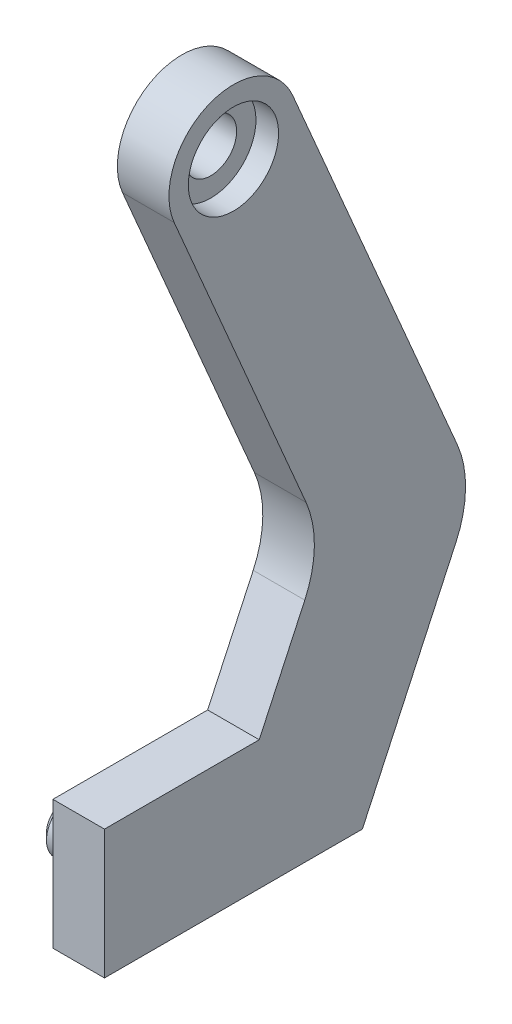
ISO-10303-21;
HEADER;
FILE_DESCRIPTION(('STEP AP214'),'2;1');
FILE_NAME('part.step','',(''),(''),'','','');
FILE_SCHEMA(('AUTOMOTIVE_DESIGN { 1 0 10303 214 1 1 1 1 }'));
ENDSEC;
DATA;
#1=APPLICATION_CONTEXT('core data for automotive mechanical design processes');
#2=APPLICATION_PROTOCOL_DEFINITION('international standard','automotive_design',2000,#1);
#3=PRODUCT_CONTEXT('',#1,'mechanical');
#4=PRODUCT('Part','Part','',(#3));
#5=PRODUCT_RELATED_PRODUCT_CATEGORY('part','',(#4));
#6=PRODUCT_DEFINITION_FORMATION('','',#4);
#7=PRODUCT_DEFINITION_CONTEXT('part definition',#1,'design');
#8=PRODUCT_DEFINITION('design','',#6,#7);
#9=PRODUCT_DEFINITION_SHAPE('','',#8);
#10=(LENGTH_UNIT() NAMED_UNIT(*) SI_UNIT(.MILLI.,.METRE.));
#11=(NAMED_UNIT(*) PLANE_ANGLE_UNIT() SI_UNIT($,.RADIAN.));
#12=(NAMED_UNIT(*) SI_UNIT($,.STERADIAN.) SOLID_ANGLE_UNIT());
#13=UNCERTAINTY_MEASURE_WITH_UNIT(LENGTH_MEASURE(1.E-05),#10,'distance_accuracy_value','');
#14=(GEOMETRIC_REPRESENTATION_CONTEXT(3) GLOBAL_UNCERTAINTY_ASSIGNED_CONTEXT((#13)) GLOBAL_UNIT_ASSIGNED_CONTEXT((#10,
#11,#12)) REPRESENTATION_CONTEXT('',''));
#15=CARTESIAN_POINT('',(0.,0.,0.));
#16=DIRECTION('',(0.,0.,1.));
#17=DIRECTION('',(1.,0.,0.));
#18=AXIS2_PLACEMENT_3D('',#15,#16,#17);
#19=CARTESIAN_POINT('',(140.789487757862,-15.875,57.15));
#20=DIRECTION('',(1.,0.,0.));
#21=DIRECTION('',(0.,1.,0.));
#22=AXIS2_PLACEMENT_3D('',#19,#20,#21);
#23=CYLINDRICAL_SURFACE('',#22,6.35);
#24=CARTESIAN_POINT('',(158.75,-15.875,57.15));
#25=DIRECTION('',(1.,0.,0.));
#26=DIRECTION('',(0.,1.,0.));
#27=AXIS2_PLACEMENT_3D('',#24,#25,#26);
#28=CIRCLE('',#27,6.35);
#29=CARTESIAN_POINT('',(158.75,-9.525,57.15));
#30=VERTEX_POINT('',#29);
#31=EDGE_CURVE('E333',#30,#30,#28,.F.);
#32=ORIENTED_EDGE('',*,*,#31,.T.);
#33=EDGE_LOOP('',(#32));
#34=FACE_BOUND('',#33,.T.);
#35=CARTESIAN_POINT('',(165.8874,-15.875,57.15));
#36=DIRECTION('',(1.,0.,0.));
#37=DIRECTION('',(0.,1.,0.));
#38=AXIS2_PLACEMENT_3D('',#35,#36,#37);
#39=CIRCLE('',#38,6.35);
#40=CARTESIAN_POINT('',(165.8874,-9.525,57.15));
#41=VERTEX_POINT('',#40);
#42=EDGE_CURVE('E314',#41,#41,#39,.F.);
#43=ORIENTED_EDGE('',*,*,#42,.F.);
#44=EDGE_LOOP('',(#43));
#45=FACE_BOUND('',#44,.T.);
#46=ADVANCED_FACE('F171',(#34,#45),#23,.F.);
#47=CARTESIAN_POINT('',(171.45,-174.625,88.9));
#48=DIRECTION('',(-1.,0.,0.));
#49=DIRECTION('',(0.,-1.,0.));
#50=AXIS2_PLACEMENT_3D('',#47,#48,#49);
#51=PLANE('',#50);
#52=CARTESIAN_POINT('',(171.45,-15.875,57.15));
#53=DIRECTION('',(-1.,0.,0.));
#54=DIRECTION('',(0.,-1.,0.));
#55=AXIS2_PLACEMENT_3D('',#52,#53,#54);
#56=CIRCLE('',#55,11.1125);
#57=CARTESIAN_POINT('',(171.45,-26.9875,57.15));
#58=VERTEX_POINT('',#57);
#59=EDGE_CURVE('E176',#58,#58,#56,.F.);
#60=ORIENTED_EDGE('',*,*,#59,.F.);
#61=EDGE_LOOP('',(#60));
#62=FACE_BOUND('',#61,.T.);
#63=CARTESIAN_POINT('',(171.45,-114.3,25.4));
#64=DIRECTION('',(1.,0.,0.));
#65=DIRECTION('',(0.,1.,0.));
#66=AXIS2_PLACEMENT_3D('',#63,#64,#65);
#67=CIRCLE('',#66,25.4);
#68=CARTESIAN_POINT('',(171.45,-124.994736842105,2.361280333358));
#69=VERTEX_POINT('',#68);
#70=CARTESIAN_POINT('',(171.45,-104.308882593746,2.04753604061334));
#71=VERTEX_POINT('',#70);
#72=EDGE_CURVE('E275',#69,#71,#67,.T.);
#73=ORIENTED_EDGE('',*,*,#72,.T.);
#74=DIRECTION('',(0.,-0.919388344857743,-0.393351078986368));
#75=VECTOR('',#74,1.);
#76=CARTESIAN_POINT('',(171.45,-16.8796751432936,39.4532452579516));
#77=LINE('',#76,#75);
#78=CARTESIAN_POINT('',(171.45,-9.63055162109135,42.5547100253833));
#79=VERTEX_POINT('',#78);
#80=EDGE_CURVE('E297',#79,#71,#77,.T.);
#81=ORIENTED_EDGE('',*,*,#80,.F.);
#82=CARTESIAN_POINT('',(171.45,-15.875,57.15));
#83=DIRECTION('',(1.,0.,0.));
#84=DIRECTION('',(0.,1.,0.));
#85=AXIS2_PLACEMENT_3D('',#82,#83,#84);
#86=CIRCLE('',#85,15.875);
#87=CARTESIAN_POINT('',(171.45,-22.1194483789086,71.7452899746167));
#88=VERTEX_POINT('',#87);
#89=EDGE_CURVE('E217',#79,#88,#86,.T.);
#90=ORIENTED_EDGE('',*,*,#89,.T.);
#91=DIRECTION('',(0.,0.919388344857743,0.393351078986369));
#92=VECTOR('',#91,1.);
#93=CARTESIAN_POINT('',(171.45,-98.0258667476643,39.2694904560132));
#94=LINE('',#93,#92);
#95=CARTESIAN_POINT('',(171.45,-98.0258667476643,39.2694904560132));
#96=VERTEX_POINT('',#95);
#97=EDGE_CURVE('E259',#88,#96,#94,.F.);
#98=ORIENTED_EDGE('',*,*,#97,.T.);
#99=CARTESIAN_POINT('',(171.45,-108.016984153918,62.6219544153998));
#100=DIRECTION('',(1.,0.,0.));
#101=DIRECTION('',(0.,1.,0.));
#102=AXIS2_PLACEMENT_3D('',#99,#100,#101);
#103=CIRCLE('',#102,25.4);
#104=CARTESIAN_POINT('',(171.45,-118.711720996023,39.5832347487578));
#105=VERTEX_POINT('',#104);
#106=EDGE_CURVE('E260',#105,#96,#103,.T.);
#107=ORIENTED_EDGE('',*,*,#106,.F.);
#108=DIRECTION('',(0.,-0.90703620734811,0.421052631578947));
#109=VECTOR('',#108,1.);
#110=CARTESIAN_POINT('',(171.45,-183.546961451508,69.6802125669307));
#111=LINE('',#110,#109);
#112=CARTESIAN_POINT('',(171.45,-142.875,50.8));
#113=VERTEX_POINT('',#112);
#114=EDGE_CURVE('E354',#105,#113,#111,.T.);
#115=ORIENTED_EDGE('',*,*,#114,.T.);
#116=DIRECTION('',(0.,0.,-1.));
#117=VECTOR('',#116,1.);
#118=CARTESIAN_POINT('',(171.45,-142.875,88.9));
#119=LINE('',#118,#117);
#120=CARTESIAN_POINT('',(171.45,-142.875,88.9));
#121=VERTEX_POINT('',#120);
#122=EDGE_CURVE('E345',#121,#113,#119,.T.);
#123=ORIENTED_EDGE('',*,*,#122,.F.);
#124=DIRECTION('',(0.,1.,0.));
#125=VECTOR('',#124,1.);
#126=CARTESIAN_POINT('',(171.45,-174.625,88.9));
#127=LINE('',#126,#125);
#128=CARTESIAN_POINT('',(171.45,-174.625,88.9));
#129=VERTEX_POINT('',#128);
#130=EDGE_CURVE('E286',#129,#121,#127,.T.);
#131=ORIENTED_EDGE('',*,*,#130,.F.);
#132=DIRECTION('',(0.,0.,-1.));
#133=VECTOR('',#132,1.);
#134=CARTESIAN_POINT('',(171.45,-174.625,88.9));
#135=LINE('',#134,#133);
#136=CARTESIAN_POINT('',(171.45,-174.625,25.4));
#137=VERTEX_POINT('',#136);
#138=EDGE_CURVE('E291',#129,#137,#135,.T.);
#139=ORIENTED_EDGE('',*,*,#138,.T.);
#140=DIRECTION('',(0.,-0.90703620734811,0.421052631578948));
#141=VECTOR('',#140,1.);
#142=CARTESIAN_POINT('',(171.45,-198.876283859623,36.6576177285319));
#143=LINE('',#142,#141);
#144=EDGE_CURVE('E358',#69,#137,#143,.T.);
#145=ORIENTED_EDGE('',*,*,#144,.F.);
#146=EDGE_LOOP('',(#73,#81,#90,#98,#107,#115,#123,#131,#139,#145));
#147=FACE_BOUND('',#146,.T.);
#148=ADVANCED_FACE('F373',(#62,#147),#51,.F.);
#149=CARTESIAN_POINT('',(158.75,0.,88.9));
#150=DIRECTION('',(1.,0.,0.));
#151=DIRECTION('',(0.,1.,0.));
#152=AXIS2_PLACEMENT_3D('',#149,#150,#151);
#153=PLANE('',#152);
#154=CARTESIAN_POINT('',(158.75,-158.75,38.1));
#155=DIRECTION('',(1.,0.,0.));
#156=DIRECTION('',(0.,1.,0.));
#157=AXIS2_PLACEMENT_3D('',#154,#155,#156);
#158=CIRCLE('',#157,6.35);
#159=CARTESIAN_POINT('',(158.75,-152.4,38.1));
#160=VERTEX_POINT('',#159);
#161=EDGE_CURVE('E304',#160,#160,#158,.F.);
#162=ORIENTED_EDGE('',*,*,#161,.F.);
#163=EDGE_LOOP('',(#162));
#164=FACE_BOUND('',#163,.T.);
#165=CARTESIAN_POINT('',(158.75,-158.75,76.2));
#166=DIRECTION('',(1.,0.,0.));
#167=DIRECTION('',(0.,1.,0.));
#168=AXIS2_PLACEMENT_3D('',#165,#166,#167);
#169=CIRCLE('',#168,6.34999999999999);
#170=CARTESIAN_POINT('',(158.75,-152.4,76.2));
#171=VERTEX_POINT('',#170);
#172=EDGE_CURVE('E293',#171,#171,#169,.F.);
#173=ORIENTED_EDGE('',*,*,#172,.F.);
#174=EDGE_LOOP('',(#173));
#175=FACE_BOUND('',#174,.T.);
#176=ORIENTED_EDGE('',*,*,#31,.F.);
#177=EDGE_LOOP('',(#176));
#178=FACE_BOUND('',#177,.T.);
#179=DIRECTION('',(0.,-0.919388344857743,-0.393351078986368));
#180=VECTOR('',#179,1.);
#181=CARTESIAN_POINT('',(158.75,15.270333990659,53.2083041000544));
#182=LINE('',#181,#180);
#183=CARTESIAN_POINT('',(158.75,-9.63055162109131,42.5547100253833));
#184=VERTEX_POINT('',#183);
#185=CARTESIAN_POINT('',(158.75,-104.308882593746,2.04753604061334));
#186=VERTEX_POINT('',#185);
#187=EDGE_CURVE('E301',#184,#186,#182,.T.);
#188=ORIENTED_EDGE('',*,*,#187,.T.);
#189=CARTESIAN_POINT('',(158.75,-114.3,25.4));
#190=DIRECTION('',(1.,0.,0.));
#191=DIRECTION('',(0.,1.,0.));
#192=AXIS2_PLACEMENT_3D('',#189,#190,#191);
#193=CIRCLE('',#192,25.4);
#194=CARTESIAN_POINT('',(158.75,-124.994736842105,2.36128033335801));
#195=VERTEX_POINT('',#194);
#196=EDGE_CURVE('E279',#195,#186,#193,.T.);
#197=ORIENTED_EDGE('',*,*,#196,.F.);
#198=DIRECTION('',(0.,0.90703620734811,-0.421052631578948));
#199=VECTOR('',#198,1.);
#200=CARTESIAN_POINT('',(158.75,-55.2097326130858,-30.0334128854318));
#201=LINE('',#200,#199);
#202=CARTESIAN_POINT('',(158.75,-174.625,25.4));
#203=VERTEX_POINT('',#202);
#204=EDGE_CURVE('E357',#203,#195,#201,.T.);
#205=ORIENTED_EDGE('',*,*,#204,.F.);
#206=DIRECTION('',(0.,0.,1.));
#207=VECTOR('',#206,1.);
#208=CARTESIAN_POINT('',(158.75,-174.625,0.));
#209=LINE('',#208,#207);
#210=CARTESIAN_POINT('',(158.75,-174.625,88.9));
#211=VERTEX_POINT('',#210);
#212=EDGE_CURVE('E320',#203,#211,#209,.T.);
#213=ORIENTED_EDGE('',*,*,#212,.T.);
#214=DIRECTION('',(0.,1.,0.));
#215=VECTOR('',#214,1.);
#216=CARTESIAN_POINT('',(158.75,0.,88.9));
#217=LINE('',#216,#215);
#218=CARTESIAN_POINT('',(158.75,-142.875,88.9));
#219=VERTEX_POINT('',#218);
#220=EDGE_CURVE('E331',#211,#219,#217,.T.);
#221=ORIENTED_EDGE('',*,*,#220,.T.);
#222=DIRECTION('',(0.,0.,1.));
#223=VECTOR('',#222,1.);
#224=CARTESIAN_POINT('',(158.75,-142.875,88.9));
#225=LINE('',#224,#223);
#226=CARTESIAN_POINT('',(158.75,-142.875,50.8));
#227=VERTEX_POINT('',#226);
#228=EDGE_CURVE('E328',#227,#219,#225,.T.);
#229=ORIENTED_EDGE('',*,*,#228,.F.);
#230=DIRECTION('',(0.,0.90703620734811,-0.421052631578947));
#231=VECTOR('',#230,1.);
#232=CARTESIAN_POINT('',(158.75,-39.8804102049706,2.98918195296699));
#233=LINE('',#232,#231);
#234=CARTESIAN_POINT('',(158.75,-118.711720996023,39.5832347487579));
#235=VERTEX_POINT('',#234);
#236=EDGE_CURVE('E274',#227,#235,#233,.T.);
#237=ORIENTED_EDGE('',*,*,#236,.T.);
#238=CARTESIAN_POINT('',(158.75,-108.016984153918,62.6219544153998));
#239=DIRECTION('',(1.,0.,0.));
#240=DIRECTION('',(0.,1.,0.));
#241=AXIS2_PLACEMENT_3D('',#238,#239,#240);
#242=CIRCLE('',#241,25.4);
#243=CARTESIAN_POINT('',(158.75,-98.0258667476643,39.2694904560132));
#244=VERTEX_POINT('',#243);
#245=EDGE_CURVE('E265',#235,#244,#242,.T.);
#246=ORIENTED_EDGE('',*,*,#245,.T.);
#247=DIRECTION('',(0.,-0.919388344857743,-0.393351078986369));
#248=VECTOR('',#247,1.);
#249=CARTESIAN_POINT('',(158.75,2.7814372328418,82.3988840492878));
#250=LINE('',#249,#248);
#251=CARTESIAN_POINT('',(158.75,-22.1194483789086,71.7452899746167));
#252=VERTEX_POINT('',#251);
#253=EDGE_CURVE('E252',#252,#244,#250,.T.);
#254=ORIENTED_EDGE('',*,*,#253,.F.);
#255=CARTESIAN_POINT('',(158.75,-15.875,57.15));
#256=DIRECTION('',(1.,0.,0.));
#257=DIRECTION('',(0.,1.,0.));
#258=AXIS2_PLACEMENT_3D('',#255,#256,#257);
#259=CIRCLE('',#258,15.875);
#260=EDGE_CURVE('E228',#184,#252,#259,.T.);
#261=ORIENTED_EDGE('',*,*,#260,.F.);
#262=EDGE_LOOP('',(#188,#197,#205,#213,#221,#229,#237,#246,#254,#261));
#263=FACE_BOUND('',#262,.T.);
#264=ADVANCED_FACE('F271',(#164,#175,#178,#263),#153,.F.);
#265=CARTESIAN_POINT('',(0.,-174.625,88.9));
#266=DIRECTION('',(0.,1.,0.));
#267=DIRECTION('',(-1.,0.,0.));
#268=AXIS2_PLACEMENT_3D('',#265,#266,#267);
#269=PLANE('',#268);
#270=DIRECTION('',(1.,0.,0.));
#271=VECTOR('',#270,1.);
#272=CARTESIAN_POINT('',(0.,-174.625,88.9));
#273=LINE('',#272,#271);
#274=EDGE_CURVE('E191',#211,#129,#273,.T.);
#275=ORIENTED_EDGE('',*,*,#274,.F.);
#276=ORIENTED_EDGE('',*,*,#212,.F.);
#277=DIRECTION('',(1.,0.,0.));
#278=VECTOR('',#277,1.);
#279=CARTESIAN_POINT('',(0.,-174.625,25.4));
#280=LINE('',#279,#278);
#281=EDGE_CURVE('E348',#203,#137,#280,.T.);
#282=ORIENTED_EDGE('',*,*,#281,.T.);
#283=ORIENTED_EDGE('',*,*,#138,.F.);
#284=EDGE_LOOP('',(#275,#276,#282,#283));
#285=FACE_BOUND('',#284,.T.);
#286=ADVANCED_FACE('F377',(#285),#269,.F.);
#287=CARTESIAN_POINT('',(0.,0.,88.9));
#288=DIRECTION('',(0.,0.,1.));
#289=DIRECTION('',(1.,0.,0.));
#290=AXIS2_PLACEMENT_3D('',#287,#288,#289);
#291=PLANE('',#290);
#292=ORIENTED_EDGE('',*,*,#220,.F.);
#293=ORIENTED_EDGE('',*,*,#274,.T.);
#294=ORIENTED_EDGE('',*,*,#130,.T.);
#295=DIRECTION('',(-1.,0.,0.));
#296=VECTOR('',#295,1.);
#297=CARTESIAN_POINT('',(158.75,-142.875,88.9));
#298=LINE('',#297,#296);
#299=EDGE_CURVE('E288',#121,#219,#298,.T.);
#300=ORIENTED_EDGE('',*,*,#299,.T.);
#301=EDGE_LOOP('',(#292,#293,#294,#300));
#302=FACE_BOUND('',#301,.T.);
#303=ADVANCED_FACE('F384',(#302),#291,.T.);
#304=CARTESIAN_POINT('',(158.75,-142.875,88.9));
#305=DIRECTION('',(0.,-1.,0.));
#306=DIRECTION('',(1.,0.,0.));
#307=AXIS2_PLACEMENT_3D('',#304,#305,#306);
#308=PLANE('',#307);
#309=DIRECTION('',(1.,0.,0.));
#310=VECTOR('',#309,1.);
#311=CARTESIAN_POINT('',(0.,-142.875,50.8));
#312=LINE('',#311,#310);
#313=EDGE_CURVE('E342',#227,#113,#312,.T.);
#314=ORIENTED_EDGE('',*,*,#313,.F.);
#315=ORIENTED_EDGE('',*,*,#228,.T.);
#316=ORIENTED_EDGE('',*,*,#299,.F.);
#317=ORIENTED_EDGE('',*,*,#122,.T.);
#318=EDGE_LOOP('',(#314,#315,#316,#317));
#319=FACE_BOUND('',#318,.T.);
#320=ADVANCED_FACE('F387',(#319),#308,.F.);
#321=CARTESIAN_POINT('',(0.,-114.3,25.4));
#322=DIRECTION('',(1.,0.,0.));
#323=DIRECTION('',(0.,1.,0.));
#324=AXIS2_PLACEMENT_3D('',#321,#322,#323);
#325=CYLINDRICAL_SURFACE('',#324,25.4);
#326=ORIENTED_EDGE('',*,*,#72,.F.);
#327=DIRECTION('',(1.,0.,0.));
#328=VECTOR('',#327,1.);
#329=CARTESIAN_POINT('',(0.,-124.994736842105,2.36128033335801));
#330=LINE('',#329,#328);
#331=EDGE_CURVE('E300',#195,#69,#330,.T.);
#332=ORIENTED_EDGE('',*,*,#331,.F.);
#333=ORIENTED_EDGE('',*,*,#196,.T.);
#334=DIRECTION('',(1.,0.,0.));
#335=VECTOR('',#334,1.);
#336=CARTESIAN_POINT('',(0.,-104.308882593746,2.04753604061334));
#337=LINE('',#336,#335);
#338=EDGE_CURVE('E338',#186,#71,#337,.T.);
#339=ORIENTED_EDGE('',*,*,#338,.T.);
#340=EDGE_LOOP('',(#326,#332,#333,#339));
#341=FACE_BOUND('',#340,.T.);
#342=ADVANCED_FACE('F367',(#341),#325,.T.);
#343=CARTESIAN_POINT('',(0.,-21.2579352096134,-45.7940777053765));
#344=DIRECTION('',(0.,-0.421052631578948,-0.90703620734811));
#345=DIRECTION('',(0.,0.90703620734811,-0.421052631578948));
#346=AXIS2_PLACEMENT_3D('',#343,#344,#345);
#347=PLANE('',#346);
#348=ORIENTED_EDGE('',*,*,#144,.T.);
#349=ORIENTED_EDGE('',*,*,#281,.F.);
#350=ORIENTED_EDGE('',*,*,#204,.T.);
#351=ORIENTED_EDGE('',*,*,#331,.T.);
#352=EDGE_LOOP('',(#348,#349,#350,#351));
#353=FACE_BOUND('',#352,.T.);
#354=ADVANCED_FACE('F381',(#353),#347,.T.);
#355=CARTESIAN_POINT('',(0.,-15.875,57.15));
#356=DIRECTION('',(1.,0.,0.));
#357=DIRECTION('',(0.,1.,0.));
#358=AXIS2_PLACEMENT_3D('',#355,#356,#357);
#359=CYLINDRICAL_SURFACE('',#358,15.875);
#360=ORIENTED_EDGE('',*,*,#89,.F.);
#361=DIRECTION('',(1.,0.,0.));
#362=VECTOR('',#361,1.);
#363=CARTESIAN_POINT('',(0.,-9.63055162109134,42.5547100253833));
#364=LINE('',#363,#362);
#365=EDGE_CURVE('E336',#184,#79,#364,.T.);
#366=ORIENTED_EDGE('',*,*,#365,.F.);
#367=ORIENTED_EDGE('',*,*,#260,.T.);
#368=DIRECTION('',(1.,0.,0.));
#369=VECTOR('',#368,1.);
#370=CARTESIAN_POINT('',(0.,-22.1194483789086,71.7452899746167));
#371=LINE('',#370,#369);
#372=EDGE_CURVE('E257',#252,#88,#371,.T.);
#373=ORIENTED_EDGE('',*,*,#372,.T.);
#374=EDGE_LOOP('',(#360,#366,#367,#373));
#375=FACE_BOUND('',#374,.T.);
#376=ADVANCED_FACE('F415',(#375),#359,.T.);
#377=CARTESIAN_POINT('',(0.,-29.3685719011108,68.6438252071849));
#378=DIRECTION('',(0.,-0.393351078986369,0.919388344857743));
#379=DIRECTION('',(0.,-0.919388344857743,-0.393351078986369));
#380=AXIS2_PLACEMENT_3D('',#377,#378,#379);
#381=PLANE('',#380);
#382=ORIENTED_EDGE('',*,*,#97,.F.);
#383=ORIENTED_EDGE('',*,*,#372,.F.);
#384=ORIENTED_EDGE('',*,*,#253,.T.);
#385=DIRECTION('',(1.,0.,0.));
#386=VECTOR('',#385,1.);
#387=CARTESIAN_POINT('',(0.,-98.0258667476643,39.2694904560132));
#388=LINE('',#387,#386);
#389=EDGE_CURVE('E255',#244,#96,#388,.T.);
#390=ORIENTED_EDGE('',*,*,#389,.T.);
#391=EDGE_LOOP('',(#382,#383,#384,#390));
#392=FACE_BOUND('',#391,.T.);
#393=ADVANCED_FACE('F254',(#392),#381,.T.);
#394=CARTESIAN_POINT('',(0.,-108.016984153918,62.6219544153998));
#395=DIRECTION('',(1.,0.,0.));
#396=DIRECTION('',(0.,1.,0.));
#397=AXIS2_PLACEMENT_3D('',#394,#395,#396);
#398=CYLINDRICAL_SURFACE('',#397,25.4);
#399=ORIENTED_EDGE('',*,*,#389,.F.);
#400=ORIENTED_EDGE('',*,*,#245,.F.);
#401=DIRECTION('',(1.,0.,0.));
#402=VECTOR('',#401,1.);
#403=CARTESIAN_POINT('',(0.,-118.711720996023,39.5832347487579));
#404=LINE('',#403,#402);
#405=EDGE_CURVE('E268',#235,#105,#404,.T.);
#406=ORIENTED_EDGE('',*,*,#405,.T.);
#407=ORIENTED_EDGE('',*,*,#106,.T.);
#408=EDGE_LOOP('',(#399,#400,#406,#407));
#409=FACE_BOUND('',#408,.T.);
#410=ADVANCED_FACE('F263',(#409),#398,.F.);
#411=CARTESIAN_POINT('',(0.,-5.92861280149817,-12.7714828669776));
#412=DIRECTION('',(0.,-0.421052631578947,-0.90703620734811));
#413=DIRECTION('',(0.,0.90703620734811,-0.421052631578947));
#414=AXIS2_PLACEMENT_3D('',#411,#412,#413);
#415=PLANE('',#414);
#416=ORIENTED_EDGE('',*,*,#405,.F.);
#417=ORIENTED_EDGE('',*,*,#236,.F.);
#418=ORIENTED_EDGE('',*,*,#313,.T.);
#419=ORIENTED_EDGE('',*,*,#114,.F.);
#420=EDGE_LOOP('',(#416,#417,#418,#419));
#421=FACE_BOUND('',#420,.T.);
#422=ADVANCED_FACE('F389',(#421),#415,.F.);
#423=CARTESIAN_POINT('',(0.,-16.8796751432936,39.4532452579516));
#424=DIRECTION('',(0.,-0.393351078986368,0.919388344857743));
#425=DIRECTION('',(0.,-0.919388344857743,-0.393351078986368));
#426=AXIS2_PLACEMENT_3D('',#423,#424,#425);
#427=PLANE('',#426);
#428=ORIENTED_EDGE('',*,*,#338,.F.);
#429=ORIENTED_EDGE('',*,*,#187,.F.);
#430=ORIENTED_EDGE('',*,*,#365,.T.);
#431=ORIENTED_EDGE('',*,*,#80,.T.);
#432=EDGE_LOOP('',(#428,#429,#430,#431));
#433=FACE_BOUND('',#432,.T.);
#434=ADVANCED_FACE('F370',(#433),#427,.F.);
#435=CARTESIAN_POINT('',(149.225,-158.75,76.2));
#436=DIRECTION('',(1.,0.,0.));
#437=DIRECTION('',(0.,1.,0.));
#438=AXIS2_PLACEMENT_3D('',#435,#436,#437);
#439=CYLINDRICAL_SURFACE('',#438,6.34999999999999);
#440=CARTESIAN_POINT('',(150.8125,-158.75,76.2));
#441=DIRECTION('',(-1.,0.,0.));
#442=DIRECTION('',(0.,0.,1.));
#443=AXIS2_PLACEMENT_3D('',#440,#441,#442);
#444=CIRCLE('',#443,6.34999999999999);
#445=CARTESIAN_POINT('',(150.8125,-152.4,76.2));
#446=VERTEX_POINT('',#445);
#447=EDGE_CURVE('E13',#446,#446,#444,.F.);
#448=CARTESIAN_POINT('',(150.8125,-152.4,76.2));
#449=CARTESIAN_POINT('',(150.895182291667,-152.4,76.2));
#450=CARTESIAN_POINT('',(150.977864583333,-152.4,76.2));
#451=CARTESIAN_POINT('',(151.143229166667,-152.4,76.2));
#452=CARTESIAN_POINT('',(151.225911458333,-152.4,76.2));
#453=CARTESIAN_POINT('',(151.391276041667,-152.4,76.2));
#454=CARTESIAN_POINT('',(151.473958333333,-152.4,76.2));
#455=CARTESIAN_POINT('',(151.639322916667,-152.4,76.2));
#456=CARTESIAN_POINT('',(151.722005208333,-152.4,76.2));
#457=CARTESIAN_POINT('',(151.887369791667,-152.4,76.2));
#458=CARTESIAN_POINT('',(151.970052083333,-152.4,76.2));
#459=CARTESIAN_POINT('',(152.135416666667,-152.4,76.2));
#460=CARTESIAN_POINT('',(152.218098958333,-152.4,76.2));
#461=CARTESIAN_POINT('',(152.383463541667,-152.4,76.2));
#462=CARTESIAN_POINT('',(152.466145833333,-152.4,76.2));
#463=CARTESIAN_POINT('',(152.631510416667,-152.4,76.2));
#464=CARTESIAN_POINT('',(152.714192708333,-152.4,76.2));
#465=CARTESIAN_POINT('',(152.879557291667,-152.4,76.2));
#466=CARTESIAN_POINT('',(152.962239583333,-152.4,76.2));
#467=CARTESIAN_POINT('',(153.127604166667,-152.4,76.2));
#468=CARTESIAN_POINT('',(153.210286458333,-152.4,76.2));
#469=CARTESIAN_POINT('',(153.375651041667,-152.4,76.2));
#470=CARTESIAN_POINT('',(153.458333333333,-152.4,76.2));
#471=CARTESIAN_POINT('',(153.623697916667,-152.4,76.2));
#472=CARTESIAN_POINT('',(153.706380208333,-152.4,76.2));
#473=CARTESIAN_POINT('',(153.871744791667,-152.4,76.2));
#474=CARTESIAN_POINT('',(153.954427083333,-152.4,76.2));
#475=CARTESIAN_POINT('',(154.119791666667,-152.4,76.2));
#476=CARTESIAN_POINT('',(154.202473958333,-152.4,76.2));
#477=CARTESIAN_POINT('',(154.367838541667,-152.4,76.2));
#478=CARTESIAN_POINT('',(154.450520833333,-152.4,76.2));
#479=CARTESIAN_POINT('',(154.615885416667,-152.4,76.2));
#480=CARTESIAN_POINT('',(154.698567708333,-152.4,76.2));
#481=CARTESIAN_POINT('',(154.863932291667,-152.4,76.2));
#482=CARTESIAN_POINT('',(154.946614583333,-152.4,76.2));
#483=CARTESIAN_POINT('',(155.111979166667,-152.4,76.2));
#484=CARTESIAN_POINT('',(155.194661458333,-152.4,76.2));
#485=CARTESIAN_POINT('',(155.360026041667,-152.4,76.2));
#486=CARTESIAN_POINT('',(155.442708333333,-152.4,76.2));
#487=CARTESIAN_POINT('',(155.608072916667,-152.4,76.2));
#488=CARTESIAN_POINT('',(155.690755208333,-152.4,76.2));
#489=CARTESIAN_POINT('',(155.856119791667,-152.4,76.2));
#490=CARTESIAN_POINT('',(155.938802083333,-152.4,76.2));
#491=CARTESIAN_POINT('',(156.104166666667,-152.4,76.2));
#492=CARTESIAN_POINT('',(156.186848958333,-152.4,76.2));
#493=CARTESIAN_POINT('',(156.352213541667,-152.4,76.2));
#494=CARTESIAN_POINT('',(156.434895833333,-152.4,76.2));
#495=CARTESIAN_POINT('',(156.600260416667,-152.4,76.2));
#496=CARTESIAN_POINT('',(156.682942708333,-152.4,76.2));
#497=CARTESIAN_POINT('',(156.848307291667,-152.4,76.2));
#498=CARTESIAN_POINT('',(156.930989583333,-152.4,76.2));
#499=CARTESIAN_POINT('',(157.096354166667,-152.4,76.2));
#500=CARTESIAN_POINT('',(157.179036458333,-152.4,76.2));
#501=CARTESIAN_POINT('',(157.344401041667,-152.4,76.2));
#502=CARTESIAN_POINT('',(157.427083333333,-152.4,76.2));
#503=CARTESIAN_POINT('',(157.592447916667,-152.4,76.2));
#504=CARTESIAN_POINT('',(157.675130208333,-152.4,76.2));
#505=CARTESIAN_POINT('',(157.840494791667,-152.4,76.2));
#506=CARTESIAN_POINT('',(157.923177083333,-152.4,76.2));
#507=CARTESIAN_POINT('',(158.088541666667,-152.4,76.2));
#508=CARTESIAN_POINT('',(158.171223958333,-152.4,76.2));
#509=CARTESIAN_POINT('',(158.336588541667,-152.4,76.2));
#510=CARTESIAN_POINT('',(158.419270833333,-152.4,76.2));
#511=CARTESIAN_POINT('',(158.584635416667,-152.4,76.2));
#512=CARTESIAN_POINT('',(158.667317708333,-152.4,76.2));
#513=CARTESIAN_POINT('',(158.75,-152.4,76.2));
#514=B_SPLINE_CURVE_WITH_KNOTS('',3,(#448,#449,#450,#451,#452,#453,#454,#455,#456,#457,#458,
#459,#460,#461,#462,#463,#464,#465,#466,#467,#468,#469,#470,#471,#472,#473,#474,#475,#476,#477,
#478,#479,#480,#481,#482,#483,#484,#485,#486,#487,#488,#489,#490,#491,#492,#493,#494,#495,#496,
#497,#498,#499,#500,#501,#502,#503,#504,#505,#506,#507,#508,#509,#510,#511,#512,#513),
.UNSPECIFIED.,.F.,.F.,(4,2,2,2,2,2,2,2,2,2,2,2,2,2,2,2,2,2,2,2,2,2,2,2,2,2,2,2,2,2,2,2,4),(0.,
0.248046874999991,0.496093749999982,0.744140625,0.992187499999991,1.24023437500001,1.48828125,
1.73632812499999,1.98437500000001,2.232421875,2.48046875000002,2.72851562500001,2.9765625,
3.22460937500002,3.47265625000001,3.72070312500003,3.96875000000002,4.21679687500001,
4.46484375000003,4.71289062500002,4.96093750000004,5.20898437500003,5.45703125000002,
5.70507812500004,5.95312500000003,6.20117187500005,6.44921875000004,6.69726562500003,
6.94531250000005,7.19335937500004,7.44140625000006,7.68945312500005,7.93750000000004),.UNSPECIFIED.);
#515=EDGE_CURVE('BSEAM397',#446,#171,#514,.T.);
#516=ORIENTED_EDGE('',*,*,#447,.T.);
#517=ORIENTED_EDGE('',*,*,#172,.T.);
#518=ORIENTED_EDGE('',*,*,#515,.T.);
#519=ORIENTED_EDGE('',*,*,#515,.F.);
#520=EDGE_LOOP('',(#516,#518,#517,#519));
#521=FACE_BOUND('',#520,.T.);
#522=ADVANCED_FACE('F397',(#521),#439,.T.);
#523=CARTESIAN_POINT('',(149.225,-158.75,76.2));
#524=DIRECTION('',(-1.,0.,0.));
#525=DIRECTION('',(0.,-1.,0.));
#526=AXIS2_PLACEMENT_3D('',#523,#524,#525);
#527=PLANE('',#526);
#528=CARTESIAN_POINT('',(149.225,-158.75,76.2));
#529=DIRECTION('',(-1.,0.,0.));
#530=DIRECTION('',(0.,-1.,0.));
#531=AXIS2_PLACEMENT_3D('',#528,#529,#530);
#532=CIRCLE('',#531,4.76250000000006);
#533=CARTESIAN_POINT('',(149.225,-163.5125,76.2));
#534=VERTEX_POINT('',#533);
#535=EDGE_CURVE('E182',#534,#534,#532,.T.);
#536=ORIENTED_EDGE('',*,*,#535,.T.);
#537=EDGE_LOOP('',(#536));
#538=FACE_BOUND('',#537,.T.);
#539=ADVANCED_FACE('F493',(#538),#527,.T.);
#540=CARTESIAN_POINT('',(149.225,-158.75,38.1));
#541=DIRECTION('',(1.,0.,0.));
#542=DIRECTION('',(0.,1.,0.));
#543=AXIS2_PLACEMENT_3D('',#540,#541,#542);
#544=CYLINDRICAL_SURFACE('',#543,6.35);
#545=CARTESIAN_POINT('',(150.8125,-158.75,38.1));
#546=DIRECTION('',(-1.,0.,0.));
#547=DIRECTION('',(0.,0.,1.));
#548=AXIS2_PLACEMENT_3D('',#545,#546,#547);
#549=CIRCLE('',#548,6.35);
#550=CARTESIAN_POINT('',(150.8125,-152.4,38.1));
#551=VERTEX_POINT('',#550);
#552=EDGE_CURVE('E310',#551,#551,#549,.F.);
#553=CARTESIAN_POINT('',(150.8125,-152.4,38.1));
#554=CARTESIAN_POINT('',(150.895182291667,-152.4,38.1));
#555=CARTESIAN_POINT('',(150.977864583333,-152.4,38.1));
#556=CARTESIAN_POINT('',(151.143229166667,-152.4,38.1));
#557=CARTESIAN_POINT('',(151.225911458333,-152.4,38.1));
#558=CARTESIAN_POINT('',(151.391276041667,-152.4,38.1));
#559=CARTESIAN_POINT('',(151.473958333333,-152.4,38.1));
#560=CARTESIAN_POINT('',(151.639322916667,-152.4,38.1));
#561=CARTESIAN_POINT('',(151.722005208333,-152.4,38.1));
#562=CARTESIAN_POINT('',(151.887369791667,-152.4,38.1));
#563=CARTESIAN_POINT('',(151.970052083333,-152.4,38.1));
#564=CARTESIAN_POINT('',(152.135416666667,-152.4,38.1));
#565=CARTESIAN_POINT('',(152.218098958333,-152.4,38.1));
#566=CARTESIAN_POINT('',(152.383463541667,-152.4,38.1));
#567=CARTESIAN_POINT('',(152.466145833333,-152.4,38.1));
#568=CARTESIAN_POINT('',(152.631510416667,-152.4,38.1));
#569=CARTESIAN_POINT('',(152.714192708333,-152.4,38.1));
#570=CARTESIAN_POINT('',(152.879557291667,-152.4,38.1));
#571=CARTESIAN_POINT('',(152.962239583333,-152.4,38.1));
#572=CARTESIAN_POINT('',(153.127604166667,-152.4,38.1));
#573=CARTESIAN_POINT('',(153.210286458333,-152.4,38.1));
#574=CARTESIAN_POINT('',(153.375651041667,-152.4,38.1));
#575=CARTESIAN_POINT('',(153.458333333333,-152.4,38.1));
#576=CARTESIAN_POINT('',(153.623697916667,-152.4,38.1));
#577=CARTESIAN_POINT('',(153.706380208333,-152.4,38.1));
#578=CARTESIAN_POINT('',(153.871744791667,-152.4,38.1));
#579=CARTESIAN_POINT('',(153.954427083333,-152.4,38.1));
#580=CARTESIAN_POINT('',(154.119791666667,-152.4,38.1));
#581=CARTESIAN_POINT('',(154.202473958333,-152.4,38.1));
#582=CARTESIAN_POINT('',(154.367838541667,-152.4,38.1));
#583=CARTESIAN_POINT('',(154.450520833333,-152.4,38.1));
#584=CARTESIAN_POINT('',(154.615885416667,-152.4,38.1));
#585=CARTESIAN_POINT('',(154.698567708333,-152.4,38.1));
#586=CARTESIAN_POINT('',(154.863932291667,-152.4,38.1));
#587=CARTESIAN_POINT('',(154.946614583333,-152.4,38.1));
#588=CARTESIAN_POINT('',(155.111979166667,-152.4,38.1));
#589=CARTESIAN_POINT('',(155.194661458333,-152.4,38.1));
#590=CARTESIAN_POINT('',(155.360026041667,-152.4,38.1));
#591=CARTESIAN_POINT('',(155.442708333333,-152.4,38.1));
#592=CARTESIAN_POINT('',(155.608072916667,-152.4,38.1));
#593=CARTESIAN_POINT('',(155.690755208333,-152.4,38.1));
#594=CARTESIAN_POINT('',(155.856119791667,-152.4,38.1));
#595=CARTESIAN_POINT('',(155.938802083333,-152.4,38.1));
#596=CARTESIAN_POINT('',(156.104166666667,-152.4,38.1));
#597=CARTESIAN_POINT('',(156.186848958333,-152.4,38.1));
#598=CARTESIAN_POINT('',(156.352213541667,-152.4,38.1));
#599=CARTESIAN_POINT('',(156.434895833333,-152.4,38.1));
#600=CARTESIAN_POINT('',(156.600260416667,-152.4,38.1));
#601=CARTESIAN_POINT('',(156.682942708333,-152.4,38.1));
#602=CARTESIAN_POINT('',(156.848307291667,-152.4,38.1));
#603=CARTESIAN_POINT('',(156.930989583333,-152.4,38.1));
#604=CARTESIAN_POINT('',(157.096354166667,-152.4,38.1));
#605=CARTESIAN_POINT('',(157.179036458333,-152.4,38.1));
#606=CARTESIAN_POINT('',(157.344401041667,-152.4,38.1));
#607=CARTESIAN_POINT('',(157.427083333333,-152.4,38.1));
#608=CARTESIAN_POINT('',(157.592447916667,-152.4,38.1));
#609=CARTESIAN_POINT('',(157.675130208333,-152.4,38.1));
#610=CARTESIAN_POINT('',(157.840494791667,-152.4,38.1));
#611=CARTESIAN_POINT('',(157.923177083333,-152.4,38.1));
#612=CARTESIAN_POINT('',(158.088541666667,-152.4,38.1));
#613=CARTESIAN_POINT('',(158.171223958333,-152.4,38.1));
#614=CARTESIAN_POINT('',(158.336588541667,-152.4,38.1));
#615=CARTESIAN_POINT('',(158.419270833333,-152.4,38.1));
#616=CARTESIAN_POINT('',(158.584635416667,-152.4,38.1));
#617=CARTESIAN_POINT('',(158.667317708333,-152.4,38.1));
#618=CARTESIAN_POINT('',(158.75,-152.4,38.1));
#619=B_SPLINE_CURVE_WITH_KNOTS('',3,(#553,#554,#555,#556,#557,#558,#559,#560,#561,#562,#563,
#564,#565,#566,#567,#568,#569,#570,#571,#572,#573,#574,#575,#576,#577,#578,#579,#580,#581,#582,
#583,#584,#585,#586,#587,#588,#589,#590,#591,#592,#593,#594,#595,#596,#597,#598,#599,#600,#601,
#602,#603,#604,#605,#606,#607,#608,#609,#610,#611,#612,#613,#614,#615,#616,#617,#618),
.UNSPECIFIED.,.F.,.F.,(4,2,2,2,2,2,2,2,2,2,2,2,2,2,2,2,2,2,2,2,2,2,2,2,2,2,2,2,2,2,2,2,4),(0.,
0.248046874999991,0.496093749999982,0.744140625,0.992187499999991,1.24023437500001,1.48828125,
1.73632812499999,1.98437500000001,2.232421875,2.48046875000002,2.72851562500001,2.9765625,
3.22460937500002,3.47265625000001,3.72070312500003,3.96875000000002,4.21679687500001,
4.46484375000003,4.71289062500002,4.96093750000004,5.20898437500003,5.45703125000002,
5.70507812500004,5.95312500000003,6.20117187500005,6.44921875000004,6.69726562500003,
6.94531250000005,7.19335937500004,7.44140625000006,7.68945312500005,7.93750000000004),.UNSPECIFIED.);
#620=EDGE_CURVE('BSEAM501',#551,#160,#619,.T.);
#621=ORIENTED_EDGE('',*,*,#552,.T.);
#622=ORIENTED_EDGE('',*,*,#161,.T.);
#623=ORIENTED_EDGE('',*,*,#620,.T.);
#624=ORIENTED_EDGE('',*,*,#620,.F.);
#625=EDGE_LOOP('',(#621,#623,#622,#624));
#626=FACE_BOUND('',#625,.T.);
#627=ADVANCED_FACE('F501',(#626),#544,.T.);
#628=CARTESIAN_POINT('',(149.225,-158.75,38.1));
#629=DIRECTION('',(-1.,0.,0.));
#630=DIRECTION('',(0.,-1.,0.));
#631=AXIS2_PLACEMENT_3D('',#628,#629,#630);
#632=PLANE('',#631);
#633=CARTESIAN_POINT('',(149.225,-158.75,38.1));
#634=DIRECTION('',(-1.,0.,0.));
#635=DIRECTION('',(0.,-1.,0.));
#636=AXIS2_PLACEMENT_3D('',#633,#634,#635);
#637=CIRCLE('',#636,4.76250000000009);
#638=CARTESIAN_POINT('',(149.225,-163.5125,38.1));
#639=VERTEX_POINT('',#638);
#640=EDGE_CURVE('E307',#639,#639,#637,.T.);
#641=ORIENTED_EDGE('',*,*,#640,.T.);
#642=EDGE_LOOP('',(#641));
#643=FACE_BOUND('',#642,.T.);
#644=ADVANCED_FACE('F509',(#643),#632,.T.);
#645=CARTESIAN_POINT('',(149.225,-158.75,38.1));
#646=DIRECTION('',(1.,0.,0.));
#647=DIRECTION('',(0.,0.,-1.));
#648=AXIS2_PLACEMENT_3D('',#645,#646,#647);
#649=CONICAL_SURFACE('',#648,4.76250000000009,0.78539816339745);
#650=ORIENTED_EDGE('',*,*,#552,.F.);
#651=EDGE_LOOP('',(#650));
#652=FACE_BOUND('',#651,.T.);
#653=ORIENTED_EDGE('',*,*,#640,.F.);
#654=EDGE_LOOP('',(#653));
#655=FACE_BOUND('',#654,.T.);
#656=ADVANCED_FACE('F518',(#652,#655),#649,.T.);
#657=CARTESIAN_POINT('',(149.225,-158.75,76.2));
#658=DIRECTION('',(1.,0.,0.));
#659=DIRECTION('',(0.,0.,-1.));
#660=AXIS2_PLACEMENT_3D('',#657,#658,#659);
#661=CONICAL_SURFACE('',#660,4.76250000000006,0.785398163397457);
#662=ORIENTED_EDGE('',*,*,#447,.F.);
#663=EDGE_LOOP('',(#662));
#664=FACE_BOUND('',#663,.T.);
#665=ORIENTED_EDGE('',*,*,#535,.F.);
#666=EDGE_LOOP('',(#665));
#667=FACE_BOUND('',#666,.T.);
#668=ADVANCED_FACE('F174',(#664,#667),#661,.T.);
#669=CARTESIAN_POINT('',(171.450012,-15.875,57.15));
#670=DIRECTION('',(-1.,0.,0.));
#671=DIRECTION('',(0.,-1.,0.));
#672=AXIS2_PLACEMENT_3D('',#669,#670,#671);
#673=CYLINDRICAL_SURFACE('',#672,11.1125);
#674=CARTESIAN_POINT('',(165.8874,-15.875,57.15));
#675=DIRECTION('',(1.,0.,0.));
#676=DIRECTION('',(0.,1.,0.));
#677=AXIS2_PLACEMENT_3D('',#674,#675,#676);
#678=CIRCLE('',#677,11.1125);
#679=CARTESIAN_POINT('',(165.8874,-26.9875,57.15));
#680=VERTEX_POINT('',#679);
#681=EDGE_CURVE('E316',#680,#680,#678,.T.);
#682=CARTESIAN_POINT('',(165.8874,-26.9875,57.15));
#683=CARTESIAN_POINT('',(165.94534375,-26.9875,57.15));
#684=CARTESIAN_POINT('',(166.0032875,-26.9875,57.15));
#685=CARTESIAN_POINT('',(166.119175,-26.9875,57.15));
#686=CARTESIAN_POINT('',(166.17711875,-26.9875,57.15));
#687=CARTESIAN_POINT('',(166.29300625,-26.9875,57.15));
#688=CARTESIAN_POINT('',(166.35095,-26.9875,57.15));
#689=CARTESIAN_POINT('',(166.4668375,-26.9875,57.15));
#690=CARTESIAN_POINT('',(166.52478125,-26.9875,57.15));
#691=CARTESIAN_POINT('',(166.64066875,-26.9875,57.15));
#692=CARTESIAN_POINT('',(166.6986125,-26.9875,57.15));
#693=CARTESIAN_POINT('',(166.8145,-26.9875,57.15));
#694=CARTESIAN_POINT('',(166.87244375,-26.9875,57.15));
#695=CARTESIAN_POINT('',(166.98833125,-26.9875,57.15));
#696=CARTESIAN_POINT('',(167.046275,-26.9875,57.15));
#697=CARTESIAN_POINT('',(167.1621625,-26.9875,57.15));
#698=CARTESIAN_POINT('',(167.22010625,-26.9875,57.15));
#699=CARTESIAN_POINT('',(167.33599375,-26.9875,57.15));
#700=CARTESIAN_POINT('',(167.3939375,-26.9875,57.15));
#701=CARTESIAN_POINT('',(167.509825,-26.9875,57.15));
#702=CARTESIAN_POINT('',(167.56776875,-26.9875,57.15));
#703=CARTESIAN_POINT('',(167.68365625,-26.9875,57.15));
#704=CARTESIAN_POINT('',(167.7416,-26.9875,57.15));
#705=CARTESIAN_POINT('',(167.8574875,-26.9875,57.15));
#706=CARTESIAN_POINT('',(167.91543125,-26.9875,57.15));
#707=CARTESIAN_POINT('',(168.03131875,-26.9875,57.15));
#708=CARTESIAN_POINT('',(168.0892625,-26.9875,57.15));
#709=CARTESIAN_POINT('',(168.20515,-26.9875,57.15));
#710=CARTESIAN_POINT('',(168.26309375,-26.9875,57.15));
#711=CARTESIAN_POINT('',(168.37898125,-26.9875,57.15));
#712=CARTESIAN_POINT('',(168.436925,-26.9875,57.15));
#713=CARTESIAN_POINT('',(168.5528125,-26.9875,57.15));
#714=CARTESIAN_POINT('',(168.61075625,-26.9875,57.15));
#715=CARTESIAN_POINT('',(168.72664375,-26.9875,57.15));
#716=CARTESIAN_POINT('',(168.7845875,-26.9875,57.15));
#717=CARTESIAN_POINT('',(168.900475,-26.9875,57.15));
#718=CARTESIAN_POINT('',(168.95841875,-26.9875,57.15));
#719=CARTESIAN_POINT('',(169.07430625,-26.9875,57.15));
#720=CARTESIAN_POINT('',(169.13225,-26.9875,57.15));
#721=CARTESIAN_POINT('',(169.2481375,-26.9875,57.15));
#722=CARTESIAN_POINT('',(169.30608125,-26.9875,57.15));
#723=CARTESIAN_POINT('',(169.42196875,-26.9875,57.15));
#724=CARTESIAN_POINT('',(169.4799125,-26.9875,57.15));
#725=CARTESIAN_POINT('',(169.5958,-26.9875,57.15));
#726=CARTESIAN_POINT('',(169.65374375,-26.9875,57.15));
#727=CARTESIAN_POINT('',(169.76963125,-26.9875,57.15));
#728=CARTESIAN_POINT('',(169.827575,-26.9875,57.15));
#729=CARTESIAN_POINT('',(169.9434625,-26.9875,57.15));
#730=CARTESIAN_POINT('',(170.00140625,-26.9875,57.15));
#731=CARTESIAN_POINT('',(170.11729375,-26.9875,57.15));
#732=CARTESIAN_POINT('',(170.1752375,-26.9875,57.15));
#733=CARTESIAN_POINT('',(170.291125,-26.9875,57.15));
#734=CARTESIAN_POINT('',(170.34906875,-26.9875,57.15));
#735=CARTESIAN_POINT('',(170.46495625,-26.9875,57.15));
#736=CARTESIAN_POINT('',(170.5229,-26.9875,57.15));
#737=CARTESIAN_POINT('',(170.6387875,-26.9875,57.15));
#738=CARTESIAN_POINT('',(170.69673125,-26.9875,57.15));
#739=CARTESIAN_POINT('',(170.81261875,-26.9875,57.15));
#740=CARTESIAN_POINT('',(170.8705625,-26.9875,57.15));
#741=CARTESIAN_POINT('',(170.98645,-26.9875,57.15));
#742=CARTESIAN_POINT('',(171.04439375,-26.9875,57.15));
#743=CARTESIAN_POINT('',(171.16028125,-26.9875,57.15));
#744=CARTESIAN_POINT('',(171.218225,-26.9875,57.15));
#745=CARTESIAN_POINT('',(171.3341125,-26.9875,57.15));
#746=CARTESIAN_POINT('',(171.39205625,-26.9875,57.15));
#747=CARTESIAN_POINT('',(171.45,-26.9875,57.15));
#748=B_SPLINE_CURVE_WITH_KNOTS('',3,(#682,#683,#684,#685,#686,#687,#688,#689,#690,#691,#692,
#693,#694,#695,#696,#697,#698,#699,#700,#701,#702,#703,#704,#705,#706,#707,#708,#709,#710,#711,
#712,#713,#714,#715,#716,#717,#718,#719,#720,#721,#722,#723,#724,#725,#726,#727,#728,#729,#730,
#731,#732,#733,#734,#735,#736,#737,#738,#739,#740,#741,#742,#743,#744,#745,#746,#747),
.UNSPECIFIED.,.F.,.F.,(4,2,2,2,2,2,2,2,2,2,2,2,2,2,2,2,2,2,2,2,2,2,2,2,2,2,2,2,2,2,2,2,4),(0.,
0.173831250000006,0.347662500000012,0.521493750000018,0.695325000000024,0.869156250000003,
1.04298750000001,1.21681875000001,1.39065000000002,1.56448125000003,1.73831250000001,
1.91214375000001,2.08597500000002,2.25980625000002,2.4336375,2.60746875000001,2.78130000000001,
2.95513125000002,3.12896250000003,3.30279375,3.47662500000001,3.65045625000002,3.82428750000002,
3.99811875,4.17195000000001,4.34578125000001,4.51961250000002,4.69344375000003,4.867275,
5.04110625000001,5.21493750000002,5.38876875000002,5.56260000000003),.UNSPECIFIED.);
#749=EDGE_CURVE('BSEAM532',#680,#58,#748,.T.);
#750=ORIENTED_EDGE('',*,*,#681,.F.);
#751=ORIENTED_EDGE('',*,*,#59,.T.);
#752=ORIENTED_EDGE('',*,*,#749,.T.);
#753=ORIENTED_EDGE('',*,*,#749,.F.);
#754=EDGE_LOOP('',(#750,#752,#751,#753));
#755=FACE_BOUND('',#754,.T.);
#756=ADVANCED_FACE('F532',(#755),#673,.F.);
#757=CARTESIAN_POINT('',(165.8874,-15.875,57.15));
#758=DIRECTION('',(1.,0.,0.));
#759=DIRECTION('',(0.,1.,0.));
#760=AXIS2_PLACEMENT_3D('',#757,#758,#759);
#761=PLANE('',#760);
#762=ORIENTED_EDGE('',*,*,#681,.T.);
#763=EDGE_LOOP('',(#762));
#764=FACE_BOUND('',#763,.T.);
#765=ORIENTED_EDGE('',*,*,#42,.T.);
#766=EDGE_LOOP('',(#765));
#767=FACE_BOUND('',#766,.T.);
#768=ADVANCED_FACE('F545',(#764,#767),#761,.T.);
#769=CLOSED_SHELL('',(#46,#148,#264,#286,#303,#320,#342,#354,#376,#393,#410,#422,#434,#522,#539,
#627,#644,#656,#668,#756,#768));
#770=MANIFOLD_SOLID_BREP('B2',#769);
#771=ADVANCED_BREP_SHAPE_REPRESENTATION('',(#18,#770),#14);
#772=SHAPE_DEFINITION_REPRESENTATION(#9,#771);
ENDSEC;
END-ISO-10303-21;
